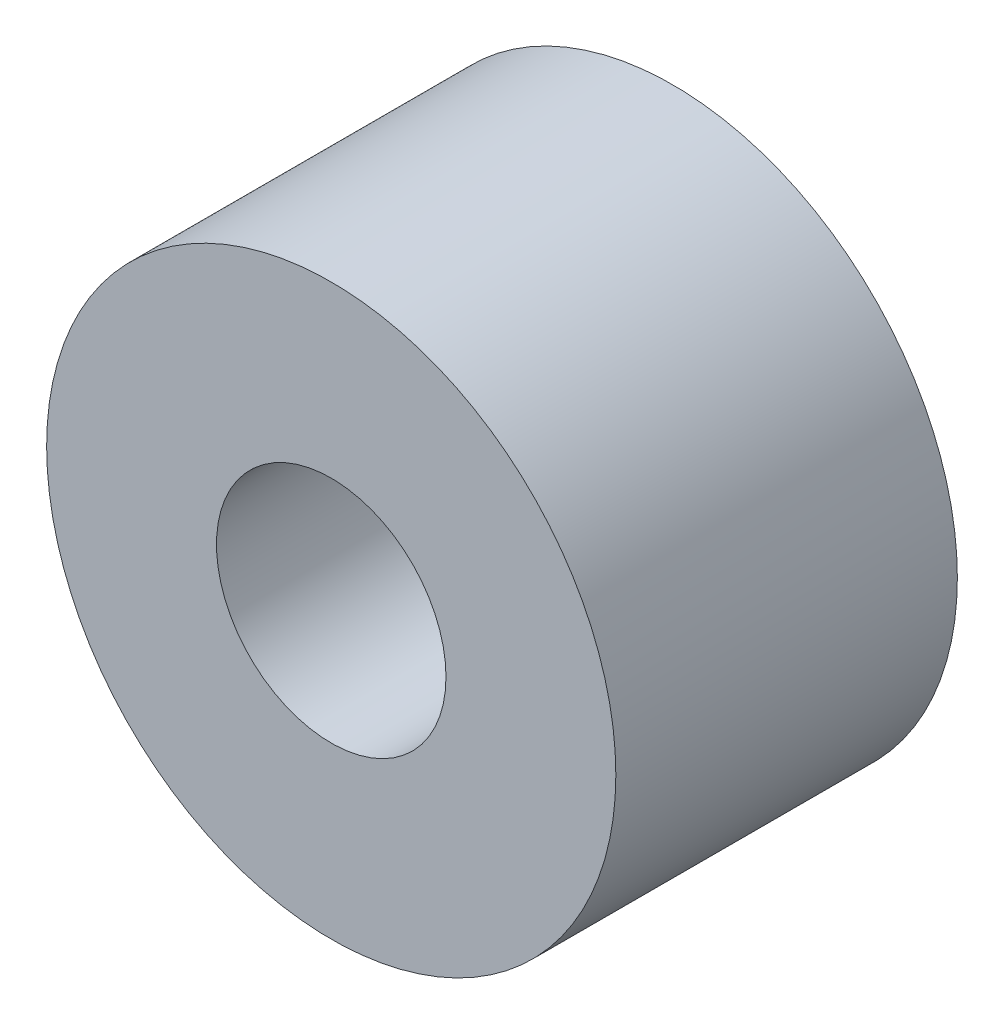
ISO-10303-21;
HEADER;
FILE_DESCRIPTION(('STEP AP214'),'2;1');
FILE_NAME('part.step','',(''),(''),'','','');
FILE_SCHEMA(('AUTOMOTIVE_DESIGN { 1 0 10303 214 1 1 1 1 }'));
ENDSEC;
DATA;
#1=APPLICATION_CONTEXT('core data for automotive mechanical design processes');
#2=APPLICATION_PROTOCOL_DEFINITION('international standard','automotive_design',2000,#1);
#3=PRODUCT_CONTEXT('',#1,'mechanical');
#4=PRODUCT('Part','Part','',(#3));
#5=PRODUCT_RELATED_PRODUCT_CATEGORY('part','',(#4));
#6=PRODUCT_DEFINITION_FORMATION('','',#4);
#7=PRODUCT_DEFINITION_CONTEXT('part definition',#1,'design');
#8=PRODUCT_DEFINITION('design','',#6,#7);
#9=PRODUCT_DEFINITION_SHAPE('','',#8);
#10=(LENGTH_UNIT() NAMED_UNIT(*) SI_UNIT(.MILLI.,.METRE.));
#11=(NAMED_UNIT(*) PLANE_ANGLE_UNIT() SI_UNIT($,.RADIAN.));
#12=(NAMED_UNIT(*) SI_UNIT($,.STERADIAN.) SOLID_ANGLE_UNIT());
#13=UNCERTAINTY_MEASURE_WITH_UNIT(LENGTH_MEASURE(1.E-05),#10,'distance_accuracy_value','');
#14=(GEOMETRIC_REPRESENTATION_CONTEXT(3) GLOBAL_UNCERTAINTY_ASSIGNED_CONTEXT((#13)) GLOBAL_UNIT_ASSIGNED_CONTEXT((#10,
#11,#12)) REPRESENTATION_CONTEXT('',''));
#15=CARTESIAN_POINT('',(0.,0.,0.));
#16=DIRECTION('',(0.,0.,1.));
#17=DIRECTION('',(1.,0.,0.));
#18=AXIS2_PLACEMENT_3D('',#15,#16,#17);
#19=CARTESIAN_POINT('',(0.,0.,4.7625));
#20=DIRECTION('',(0.,0.,1.));
#21=DIRECTION('',(1.,0.,0.));
#22=AXIS2_PLACEMENT_3D('',#19,#20,#21);
#23=PLANE('',#22);
#24=CARTESIAN_POINT('',(0.,0.,4.7625));
#25=DIRECTION('',(0.,0.,1.));
#26=DIRECTION('',(1.,0.,0.));
#27=AXIS2_PLACEMENT_3D('',#24,#25,#26);
#28=CIRCLE('',#27,7.9375);
#29=CARTESIAN_POINT('',(7.9375,0.,4.7625));
#30=VERTEX_POINT('',#29);
#31=EDGE_CURVE('E10',#30,#30,#28,.T.);
#32=ORIENTED_EDGE('',*,*,#31,.T.);
#33=EDGE_LOOP('',(#32));
#34=FACE_BOUND('',#33,.T.);
#35=CARTESIAN_POINT('',(0.,0.,4.7625));
#36=DIRECTION('',(0.,0.,1.));
#37=DIRECTION('',(1.,0.,0.));
#38=AXIS2_PLACEMENT_3D('',#35,#36,#37);
#39=CIRCLE('',#38,3.2004);
#40=CARTESIAN_POINT('',(3.2004,0.,4.7625));
#41=VERTEX_POINT('',#40);
#42=EDGE_CURVE('E44',#41,#41,#39,.T.);
#43=ORIENTED_EDGE('',*,*,#42,.F.);
#44=EDGE_LOOP('',(#43));
#45=FACE_BOUND('',#44,.T.);
#46=ADVANCED_FACE('F33',(#34,#45),#23,.T.);
#47=CARTESIAN_POINT('',(0.,0.,-4.7625));
#48=DIRECTION('',(0.,0.,1.));
#49=DIRECTION('',(1.,0.,0.));
#50=AXIS2_PLACEMENT_3D('',#47,#48,#49);
#51=PLANE('',#50);
#52=CARTESIAN_POINT('',(0.,0.,-4.7625));
#53=DIRECTION('',(0.,0.,1.));
#54=DIRECTION('',(1.,0.,0.));
#55=AXIS2_PLACEMENT_3D('',#52,#53,#54);
#56=CIRCLE('',#55,7.9375);
#57=CARTESIAN_POINT('',(7.9375,0.,-4.7625));
#58=VERTEX_POINT('',#57);
#59=EDGE_CURVE('E37',#58,#58,#56,.T.);
#60=ORIENTED_EDGE('',*,*,#59,.F.);
#61=EDGE_LOOP('',(#60));
#62=FACE_BOUND('',#61,.T.);
#63=CARTESIAN_POINT('',(0.,0.,-4.7625));
#64=DIRECTION('',(0.,0.,1.));
#65=DIRECTION('',(1.,0.,0.));
#66=AXIS2_PLACEMENT_3D('',#63,#64,#65);
#67=CIRCLE('',#66,3.2004);
#68=CARTESIAN_POINT('',(3.2004,0.,-4.7625));
#69=VERTEX_POINT('',#68);
#70=EDGE_CURVE('E46',#69,#69,#67,.T.);
#71=ORIENTED_EDGE('',*,*,#70,.T.);
#72=EDGE_LOOP('',(#71));
#73=FACE_BOUND('',#72,.T.);
#74=ADVANCED_FACE('F56',(#62,#73),#51,.F.);
#75=CARTESIAN_POINT('',(0.,0.,4.7625));
#76=DIRECTION('',(0.,0.,-1.));
#77=DIRECTION('',(-1.,0.,0.));
#78=AXIS2_PLACEMENT_3D('',#75,#76,#77);
#79=CYLINDRICAL_SURFACE('',#78,7.9375);
#80=ORIENTED_EDGE('',*,*,#31,.F.);
#81=EDGE_LOOP('',(#80));
#82=FACE_BOUND('',#81,.T.);
#83=ORIENTED_EDGE('',*,*,#59,.T.);
#84=EDGE_LOOP('',(#83));
#85=FACE_BOUND('',#84,.T.);
#86=ADVANCED_FACE('F35',(#82,#85),#79,.T.);
#87=CARTESIAN_POINT('',(0.,0.,4.7625));
#88=DIRECTION('',(0.,0.,-1.));
#89=DIRECTION('',(-1.,0.,0.));
#90=AXIS2_PLACEMENT_3D('',#87,#88,#89);
#91=CYLINDRICAL_SURFACE('',#90,3.2004);
#92=ORIENTED_EDGE('',*,*,#42,.T.);
#93=EDGE_LOOP('',(#92));
#94=FACE_BOUND('',#93,.T.);
#95=ORIENTED_EDGE('',*,*,#70,.F.);
#96=EDGE_LOOP('',(#95));
#97=FACE_BOUND('',#96,.T.);
#98=ADVANCED_FACE('F52',(#94,#97),#91,.F.);
#99=CLOSED_SHELL('',(#46,#74,#86,#98));
#100=MANIFOLD_SOLID_BREP('B2',#99);
#101=ADVANCED_BREP_SHAPE_REPRESENTATION('',(#18,#100),#14);
#102=SHAPE_DEFINITION_REPRESENTATION(#9,#101);
ENDSEC;
END-ISO-10303-21;
